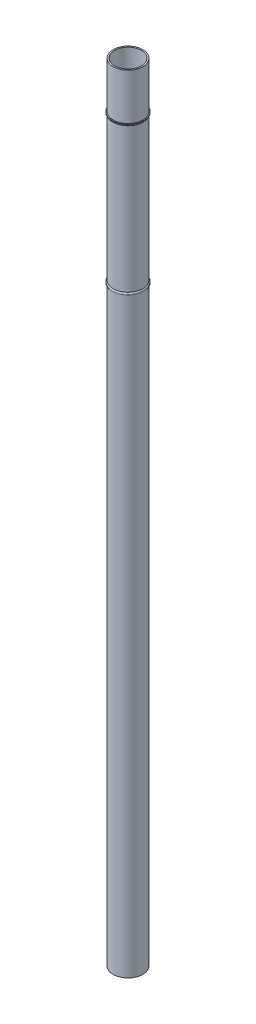
ISO-10303-21;
HEADER;
FILE_DESCRIPTION(('STEP AP214'),'2;1');
FILE_NAME('part.step','',(''),(''),'','','');
FILE_SCHEMA(('AUTOMOTIVE_DESIGN { 1 0 10303 214 1 1 1 1 }'));
ENDSEC;
DATA;
#1=APPLICATION_CONTEXT('core data for automotive mechanical design processes');
#2=APPLICATION_PROTOCOL_DEFINITION('international standard','automotive_design',2000,#1);
#3=PRODUCT_CONTEXT('',#1,'mechanical');
#4=PRODUCT('Part','Part','',(#3));
#5=PRODUCT_RELATED_PRODUCT_CATEGORY('part','',(#4));
#6=PRODUCT_DEFINITION_FORMATION('','',#4);
#7=PRODUCT_DEFINITION_CONTEXT('part definition',#1,'design');
#8=PRODUCT_DEFINITION('design','',#6,#7);
#9=PRODUCT_DEFINITION_SHAPE('','',#8);
#10=(LENGTH_UNIT() NAMED_UNIT(*) SI_UNIT(.MILLI.,.METRE.));
#11=(NAMED_UNIT(*) PLANE_ANGLE_UNIT() SI_UNIT($,.RADIAN.));
#12=(NAMED_UNIT(*) SI_UNIT($,.STERADIAN.) SOLID_ANGLE_UNIT());
#13=UNCERTAINTY_MEASURE_WITH_UNIT(LENGTH_MEASURE(1.E-05),#10,'distance_accuracy_value','');
#14=(GEOMETRIC_REPRESENTATION_CONTEXT(3) GLOBAL_UNCERTAINTY_ASSIGNED_CONTEXT((#13)) GLOBAL_UNIT_ASSIGNED_CONTEXT((#10,
#11,#12)) REPRESENTATION_CONTEXT('',''));
#15=CARTESIAN_POINT('',(0.,0.,0.));
#16=DIRECTION('',(0.,0.,1.));
#17=DIRECTION('',(1.,0.,0.));
#18=AXIS2_PLACEMENT_3D('',#15,#16,#17);
#19=CARTESIAN_POINT('',(0.,850.,0.));
#20=DIRECTION('',(0.,-1.,0.));
#21=DIRECTION('',(0.,0.,-1.));
#22=AXIS2_PLACEMENT_3D('',#19,#20,#21);
#23=CYLINDRICAL_SURFACE('',#22,16.);
#24=CARTESIAN_POINT('',(0.,800.,0.));
#25=DIRECTION('',(0.,1.,0.));
#26=DIRECTION('',(0.,0.,1.));
#27=AXIS2_PLACEMENT_3D('',#24,#25,#26);
#28=CIRCLE('',#27,16.);
#29=CARTESIAN_POINT('',(0.,800.,16.));
#30=VERTEX_POINT('',#29);
#31=EDGE_CURVE('E79',#30,#30,#28,.T.);
#32=ORIENTED_EDGE('',*,*,#31,.T.);
#33=EDGE_LOOP('',(#32));
#34=FACE_BOUND('',#33,.T.);
#35=CARTESIAN_POINT('',(0.,850.,0.));
#36=DIRECTION('',(0.,1.,0.));
#37=DIRECTION('',(0.,0.,1.));
#38=AXIS2_PLACEMENT_3D('',#35,#36,#37);
#39=CIRCLE('',#38,16.);
#40=CARTESIAN_POINT('',(0.,850.,16.));
#41=VERTEX_POINT('',#40);
#42=EDGE_CURVE('E64',#41,#41,#39,.T.);
#43=ORIENTED_EDGE('',*,*,#42,.F.);
#44=EDGE_LOOP('',(#43));
#45=FACE_BOUND('',#44,.T.);
#46=ADVANCED_FACE('F44',(#34,#45),#23,.T.);
#47=CARTESIAN_POINT('',(0.,850.,0.));
#48=DIRECTION('',(0.,1.,0.));
#49=DIRECTION('',(0.,0.,1.));
#50=AXIS2_PLACEMENT_3D('',#47,#48,#49);
#51=PLANE('',#50);
#52=CARTESIAN_POINT('',(0.,850.,0.));
#53=DIRECTION('',(0.,1.,0.));
#54=DIRECTION('',(0.,0.,1.));
#55=AXIS2_PLACEMENT_3D('',#52,#53,#54);
#56=CIRCLE('',#55,14.5);
#57=CARTESIAN_POINT('',(0.,850.,14.5));
#58=VERTEX_POINT('',#57);
#59=EDGE_CURVE('E71',#58,#58,#56,.T.);
#60=ORIENTED_EDGE('',*,*,#59,.F.);
#61=EDGE_LOOP('',(#60));
#62=FACE_BOUND('',#61,.T.);
#63=ORIENTED_EDGE('',*,*,#42,.T.);
#64=EDGE_LOOP('',(#63));
#65=FACE_BOUND('',#64,.T.);
#66=ADVANCED_FACE('F102',(#62,#65),#51,.T.);
#67=CARTESIAN_POINT('',(0.,2.,0.));
#68=DIRECTION('',(0.,1.,0.));
#69=DIRECTION('',(0.,0.,1.));
#70=AXIS2_PLACEMENT_3D('',#67,#68,#69);
#71=CYLINDRICAL_SURFACE('',#70,14.5);
#72=CARTESIAN_POINT('',(0.,2.,0.));
#73=DIRECTION('',(0.,1.,0.));
#74=DIRECTION('',(0.,0.,1.));
#75=AXIS2_PLACEMENT_3D('',#72,#73,#74);
#76=CIRCLE('',#75,14.5);
#77=CARTESIAN_POINT('',(0.,2.,14.5));
#78=VERTEX_POINT('',#77);
#79=EDGE_CURVE('E68',#78,#78,#76,.T.);
#80=ORIENTED_EDGE('',*,*,#79,.F.);
#81=EDGE_LOOP('',(#80));
#82=FACE_BOUND('',#81,.T.);
#83=ORIENTED_EDGE('',*,*,#59,.T.);
#84=EDGE_LOOP('',(#83));
#85=FACE_BOUND('',#84,.T.);
#86=ADVANCED_FACE('F107',(#82,#85),#71,.F.);
#87=CARTESIAN_POINT('',(0.,2.,0.));
#88=DIRECTION('',(0.,1.,0.));
#89=DIRECTION('',(0.,0.,1.));
#90=AXIS2_PLACEMENT_3D('',#87,#88,#89);
#91=PLANE('',#90);
#92=ORIENTED_EDGE('',*,*,#79,.T.);
#93=EDGE_LOOP('',(#92));
#94=FACE_BOUND('',#93,.T.);
#95=ADVANCED_FACE('F127',(#94),#91,.T.);
#96=CARTESIAN_POINT('',(0.,798.,0.));
#97=DIRECTION('',(0.,1.,0.));
#98=DIRECTION('',(0.,0.,1.));
#99=AXIS2_PLACEMENT_3D('',#96,#97,#98);
#100=CYLINDRICAL_SURFACE('',#99,17.);
#101=CARTESIAN_POINT('',(0.,799.414213562373,0.));
#102=DIRECTION('',(0.,-1.,0.));
#103=DIRECTION('',(0.,0.,-1.));
#104=AXIS2_PLACEMENT_3D('',#101,#102,#103);
#105=CIRCLE('',#104,17.);
#106=CARTESIAN_POINT('',(0.,799.414213562373,-17.));
#107=VERTEX_POINT('',#106);
#108=EDGE_CURVE('E55',#107,#107,#105,.F.);
#109=ORIENTED_EDGE('',*,*,#108,.T.);
#110=EDGE_LOOP('',(#109));
#111=FACE_BOUND('',#110,.T.);
#112=CARTESIAN_POINT('',(0.,800.,0.));
#113=DIRECTION('',(0.,1.,0.));
#114=DIRECTION('',(0.,0.,1.));
#115=AXIS2_PLACEMENT_3D('',#112,#113,#114);
#116=CIRCLE('',#115,17.);
#117=CARTESIAN_POINT('',(0.,800.,17.));
#118=VERTEX_POINT('',#117);
#119=EDGE_CURVE('E74',#118,#118,#116,.T.);
#120=ORIENTED_EDGE('',*,*,#119,.F.);
#121=EDGE_LOOP('',(#120));
#122=FACE_BOUND('',#121,.T.);
#123=ADVANCED_FACE('F121',(#111,#122),#100,.T.);
#124=CARTESIAN_POINT('',(0.,800.,0.));
#125=DIRECTION('',(0.,1.,0.));
#126=DIRECTION('',(0.,0.,1.));
#127=AXIS2_PLACEMENT_3D('',#124,#125,#126);
#128=PLANE('',#127);
#129=ORIENTED_EDGE('',*,*,#31,.F.);
#130=EDGE_LOOP('',(#129));
#131=FACE_BOUND('',#130,.T.);
#132=ORIENTED_EDGE('',*,*,#119,.T.);
#133=EDGE_LOOP('',(#132));
#134=FACE_BOUND('',#133,.T.);
#135=ADVANCED_FACE('F114',(#131,#134),#128,.T.);
#136=CARTESIAN_POINT('',(0.,642.,0.));
#137=DIRECTION('',(0.,1.,0.));
#138=DIRECTION('',(0.,0.,1.));
#139=AXIS2_PLACEMENT_3D('',#136,#137,#138);
#140=CIRCLE('',#139,16.);
#141=CARTESIAN_POINT('',(0.,642.,16.));
#142=VERTEX_POINT('',#141);
#143=EDGE_CURVE('E85',#142,#142,#140,.T.);
#144=ORIENTED_EDGE('',*,*,#143,.T.);
#145=EDGE_LOOP('',(#144));
#146=FACE_BOUND('',#145,.T.);
#147=CARTESIAN_POINT('',(0.,798.,0.));
#148=DIRECTION('',(0.,1.,0.));
#149=DIRECTION('',(0.,0.,1.));
#150=AXIS2_PLACEMENT_3D('',#147,#148,#149);
#151=CIRCLE('',#150,16.);
#152=CARTESIAN_POINT('',(0.,798.,16.));
#153=VERTEX_POINT('',#152);
#154=EDGE_CURVE('E59',#153,#153,#151,.T.);
#155=ORIENTED_EDGE('',*,*,#154,.F.);
#156=EDGE_LOOP('',(#155));
#157=FACE_BOUND('',#156,.T.);
#158=ADVANCED_FACE('F89',(#146,#157),#23,.T.);
#159=CARTESIAN_POINT('',(0.,799.414213562373,0.));
#160=DIRECTION('',(0.,-1.,0.));
#161=DIRECTION('',(0.,0.,-1.));
#162=AXIS2_PLACEMENT_3D('',#159,#160,#161);
#163=TOROIDAL_SURFACE('',#162,15.5,1.5);
#164=ORIENTED_EDGE('',*,*,#154,.T.);
#165=EDGE_LOOP('',(#164));
#166=FACE_BOUND('',#165,.T.);
#167=ORIENTED_EDGE('',*,*,#108,.F.);
#168=EDGE_LOOP('',(#167));
#169=FACE_BOUND('',#168,.T.);
#170=ADVANCED_FACE('F113',(#166,#169),#163,.T.);
#171=CARTESIAN_POINT('',(0.,640.,0.));
#172=DIRECTION('',(0.,1.,0.));
#173=DIRECTION('',(0.,0.,1.));
#174=AXIS2_PLACEMENT_3D('',#171,#172,#173);
#175=PLANE('',#174);
#176=CARTESIAN_POINT('',(0.,640.,0.));
#177=DIRECTION('',(0.,1.,0.));
#178=DIRECTION('',(0.,0.,1.));
#179=AXIS2_PLACEMENT_3D('',#176,#177,#178);
#180=CIRCLE('',#179,17.);
#181=CARTESIAN_POINT('',(0.,640.,17.));
#182=VERTEX_POINT('',#181);
#183=EDGE_CURVE('E82',#182,#182,#180,.T.);
#184=ORIENTED_EDGE('',*,*,#183,.F.);
#185=EDGE_LOOP('',(#184));
#186=FACE_BOUND('',#185,.T.);
#187=CARTESIAN_POINT('',(0.,640.,0.));
#188=DIRECTION('',(0.,1.,0.));
#189=DIRECTION('',(0.,0.,1.));
#190=AXIS2_PLACEMENT_3D('',#187,#188,#189);
#191=CIRCLE('',#190,16.);
#192=CARTESIAN_POINT('',(0.,640.,16.));
#193=VERTEX_POINT('',#192);
#194=EDGE_CURVE('E51',#193,#193,#191,.T.);
#195=ORIENTED_EDGE('',*,*,#194,.T.);
#196=EDGE_LOOP('',(#195));
#197=FACE_BOUND('',#196,.T.);
#198=ADVANCED_FACE('F119',(#186,#197),#175,.F.);
#199=CARTESIAN_POINT('',(0.,642.,0.));
#200=DIRECTION('',(0.,-1.,0.));
#201=DIRECTION('',(0.,0.,-1.));
#202=AXIS2_PLACEMENT_3D('',#199,#200,#201);
#203=CYLINDRICAL_SURFACE('',#202,17.);
#204=CARTESIAN_POINT('',(0.,640.585786437627,0.));
#205=DIRECTION('',(0.,1.,0.));
#206=DIRECTION('',(0.,0.,1.));
#207=AXIS2_PLACEMENT_3D('',#204,#205,#206);
#208=CIRCLE('',#207,17.);
#209=CARTESIAN_POINT('',(0.,640.585786437627,17.));
#210=VERTEX_POINT('',#209);
#211=EDGE_CURVE('E12',#210,#210,#208,.F.);
#212=ORIENTED_EDGE('',*,*,#211,.T.);
#213=EDGE_LOOP('',(#212));
#214=FACE_BOUND('',#213,.T.);
#215=ORIENTED_EDGE('',*,*,#183,.T.);
#216=EDGE_LOOP('',(#215));
#217=FACE_BOUND('',#216,.T.);
#218=ADVANCED_FACE('F133',(#214,#217),#203,.T.);
#219=CARTESIAN_POINT('',(0.,0.,0.));
#220=DIRECTION('',(0.,1.,0.));
#221=DIRECTION('',(0.,0.,1.));
#222=AXIS2_PLACEMENT_3D('',#219,#220,#221);
#223=PLANE('',#222);
#224=CARTESIAN_POINT('',(0.,0.,0.));
#225=DIRECTION('',(0.,1.,0.));
#226=DIRECTION('',(0.,0.,1.));
#227=AXIS2_PLACEMENT_3D('',#224,#225,#226);
#228=CIRCLE('',#227,16.);
#229=CARTESIAN_POINT('',(0.,0.,16.));
#230=VERTEX_POINT('',#229);
#231=EDGE_CURVE('E65',#230,#230,#228,.T.);
#232=ORIENTED_EDGE('',*,*,#231,.F.);
#233=EDGE_LOOP('',(#232));
#234=FACE_BOUND('',#233,.T.);
#235=ADVANCED_FACE('F98',(#234),#223,.F.);
#236=ORIENTED_EDGE('',*,*,#231,.T.);
#237=EDGE_LOOP('',(#236));
#238=FACE_BOUND('',#237,.T.);
#239=ORIENTED_EDGE('',*,*,#194,.F.);
#240=EDGE_LOOP('',(#239));
#241=FACE_BOUND('',#240,.T.);
#242=ADVANCED_FACE('F93',(#238,#241),#23,.T.);
#243=CARTESIAN_POINT('',(0.,640.585786437627,0.));
#244=DIRECTION('',(0.,1.,0.));
#245=DIRECTION('',(0.,0.,1.));
#246=AXIS2_PLACEMENT_3D('',#243,#244,#245);
#247=TOROIDAL_SURFACE('',#246,15.5,1.5);
#248=ORIENTED_EDGE('',*,*,#211,.F.);
#249=EDGE_LOOP('',(#248));
#250=FACE_BOUND('',#249,.T.);
#251=ORIENTED_EDGE('',*,*,#143,.F.);
#252=EDGE_LOOP('',(#251));
#253=FACE_BOUND('',#252,.T.);
#254=ADVANCED_FACE('F46',(#250,#253),#247,.T.);
#255=CLOSED_SHELL('',(#46,#66,#86,#95,#123,#135,#158,#170,#198,#218,#235,#242,#254));
#256=MANIFOLD_SOLID_BREP('B2',#255);
#257=ADVANCED_BREP_SHAPE_REPRESENTATION('',(#18,#256),#14);
#258=SHAPE_DEFINITION_REPRESENTATION(#9,#257);
ENDSEC;
END-ISO-10303-21;
